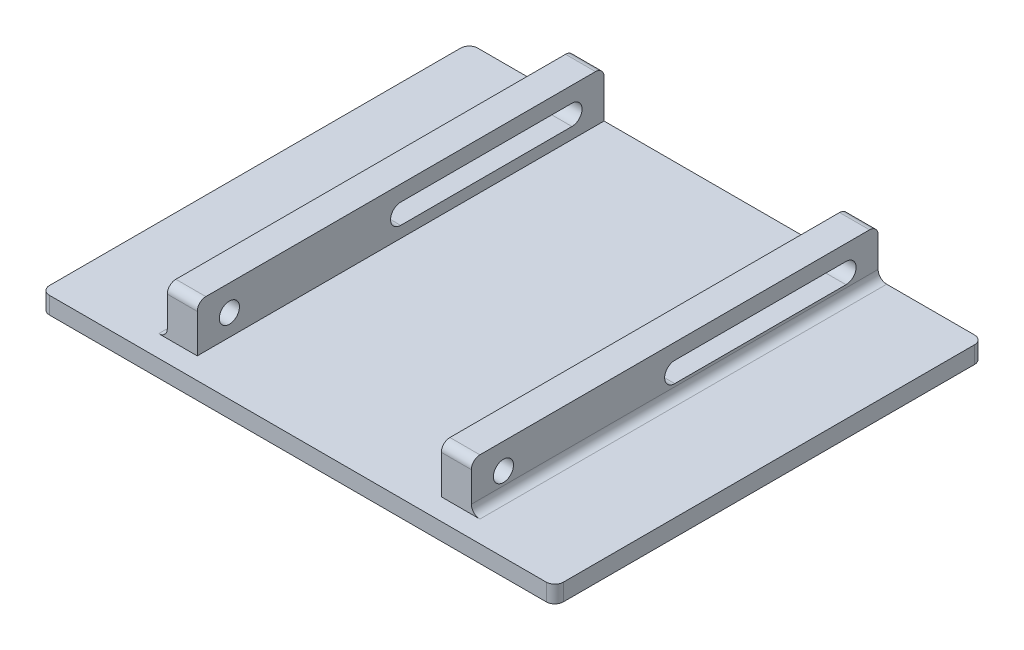
ISO-10303-21;
HEADER;
FILE_DESCRIPTION(('STEP AP214'),'2;1');
FILE_NAME('part.step','',(''),(''),'','','');
FILE_SCHEMA(('AUTOMOTIVE_DESIGN { 1 0 10303 214 1 1 1 1 }'));
ENDSEC;
DATA;
#1=APPLICATION_CONTEXT('core data for automotive mechanical design processes');
#2=APPLICATION_PROTOCOL_DEFINITION('international standard','automotive_design',2000,#1);
#3=PRODUCT_CONTEXT('',#1,'mechanical');
#4=PRODUCT('Part','Part','',(#3));
#5=PRODUCT_RELATED_PRODUCT_CATEGORY('part','',(#4));
#6=PRODUCT_DEFINITION_FORMATION('','',#4);
#7=PRODUCT_DEFINITION_CONTEXT('part definition',#1,'design');
#8=PRODUCT_DEFINITION('design','',#6,#7);
#9=PRODUCT_DEFINITION_SHAPE('','',#8);
#10=(LENGTH_UNIT() NAMED_UNIT(*) SI_UNIT(.MILLI.,.METRE.));
#11=(NAMED_UNIT(*) PLANE_ANGLE_UNIT() SI_UNIT($,.RADIAN.));
#12=(NAMED_UNIT(*) SI_UNIT($,.STERADIAN.) SOLID_ANGLE_UNIT());
#13=UNCERTAINTY_MEASURE_WITH_UNIT(LENGTH_MEASURE(1.E-05),#10,'distance_accuracy_value','');
#14=(GEOMETRIC_REPRESENTATION_CONTEXT(3) GLOBAL_UNCERTAINTY_ASSIGNED_CONTEXT((#13)) GLOBAL_UNIT_ASSIGNED_CONTEXT((#10,
#11,#12)) REPRESENTATION_CONTEXT('',''));
#15=CARTESIAN_POINT('',(0.,0.,0.));
#16=DIRECTION('',(0.,0.,1.));
#17=DIRECTION('',(1.,0.,0.));
#18=AXIS2_PLACEMENT_3D('',#15,#16,#17);
#19=CARTESIAN_POINT('',(60.,4.,-67.5));
#20=DIRECTION('',(-1.,0.,0.));
#21=DIRECTION('',(0.,0.,1.));
#22=AXIS2_PLACEMENT_3D('',#19,#20,#21);
#23=PLANE('',#22);
#24=DIRECTION('',(0.,0.,-1.));
#25=VECTOR('',#24,1.);
#26=CARTESIAN_POINT('',(60.,0.,-67.5));
#27=LINE('',#26,#25);
#28=CARTESIAN_POINT('',(60.,0.,30.5));
#29=VERTEX_POINT('',#28);
#30=CARTESIAN_POINT('',(60.,0.,-65.5));
#31=VERTEX_POINT('',#30);
#32=EDGE_CURVE('E374',#29,#31,#27,.T.);
#33=ORIENTED_EDGE('',*,*,#32,.T.);
#34=DIRECTION('',(0.,-1.,0.));
#35=VECTOR('',#34,1.);
#36=CARTESIAN_POINT('',(60.,4.,-65.5));
#37=LINE('',#36,#35);
#38=CARTESIAN_POINT('',(60.,4.,-65.5));
#39=VERTEX_POINT('',#38);
#40=EDGE_CURVE('E528',#31,#39,#37,.F.);
#41=ORIENTED_EDGE('',*,*,#40,.T.);
#42=DIRECTION('',(0.,0.,-1.));
#43=VECTOR('',#42,1.);
#44=CARTESIAN_POINT('',(60.,4.,-67.5));
#45=LINE('',#44,#43);
#46=CARTESIAN_POINT('',(60.,4.,30.5));
#47=VERTEX_POINT('',#46);
#48=EDGE_CURVE('E402',#47,#39,#45,.T.);
#49=ORIENTED_EDGE('',*,*,#48,.F.);
#50=DIRECTION('',(0.,1.,0.));
#51=VECTOR('',#50,1.);
#52=CARTESIAN_POINT('',(60.,4.,30.5));
#53=LINE('',#52,#51);
#54=EDGE_CURVE('E525',#47,#29,#53,.F.);
#55=ORIENTED_EDGE('',*,*,#54,.T.);
#56=EDGE_LOOP('',(#33,#41,#49,#55));
#57=FACE_BOUND('',#56,.T.);
#58=ADVANCED_FACE('F43',(#57),#23,.F.);
#59=CARTESIAN_POINT('',(-60.,4.,-67.5));
#60=DIRECTION('',(0.,0.,1.));
#61=DIRECTION('',(1.,0.,0.));
#62=AXIS2_PLACEMENT_3D('',#59,#60,#61);
#63=PLANE('',#62);
#64=DIRECTION('',(0.,-1.,0.));
#65=VECTOR('',#64,1.);
#66=CARTESIAN_POINT('',(28.5,15.,-67.5000000000001));
#67=LINE('',#66,#65);
#68=CARTESIAN_POINT('',(28.5,13.,-67.5000000000001));
#69=VERTEX_POINT('',#68);
#70=CARTESIAN_POINT('',(28.5,4.,-67.5));
#71=VERTEX_POINT('',#70);
#72=EDGE_CURVE('E378',#69,#71,#67,.T.);
#73=ORIENTED_EDGE('',*,*,#72,.F.);
#74=DIRECTION('',(-1.,0.,0.));
#75=VECTOR('',#74,1.);
#76=CARTESIAN_POINT('',(-60.,13.,-67.5));
#77=LINE('',#76,#75);
#78=CARTESIAN_POINT('',(35.5,13.,-67.5000000000001));
#79=VERTEX_POINT('',#78);
#80=EDGE_CURVE('E453',#69,#79,#77,.F.);
#81=ORIENTED_EDGE('',*,*,#80,.T.);
#82=DIRECTION('',(0.,-1.,0.));
#83=VECTOR('',#82,1.);
#84=CARTESIAN_POINT('',(35.5,15.,-67.5000000000001));
#85=LINE('',#84,#83);
#86=CARTESIAN_POINT('',(35.5,6.,-67.5000000000001));
#87=VERTEX_POINT('',#86);
#88=EDGE_CURVE('E342',#79,#87,#85,.T.);
#89=ORIENTED_EDGE('',*,*,#88,.T.);
#90=CARTESIAN_POINT('',(37.5,6.,-67.5));
#91=DIRECTION('',(0.,0.,1.));
#92=DIRECTION('',(1.,0.,0.));
#93=AXIS2_PLACEMENT_3D('',#90,#91,#92);
#94=CIRCLE('',#93,2.);
#95=CARTESIAN_POINT('',(37.5,4.,-67.5));
#96=VERTEX_POINT('',#95);
#97=EDGE_CURVE('E544',#87,#96,#94,.T.);
#98=ORIENTED_EDGE('',*,*,#97,.T.);
#99=DIRECTION('',(-1.,0.,0.));
#100=VECTOR('',#99,1.);
#101=CARTESIAN_POINT('',(-60.,4.,-67.5));
#102=LINE('',#101,#100);
#103=CARTESIAN_POINT('',(58.,4.,-67.5));
#104=VERTEX_POINT('',#103);
#105=EDGE_CURVE('E408',#104,#96,#102,.T.);
#106=ORIENTED_EDGE('',*,*,#105,.F.);
#107=DIRECTION('',(0.,-1.,0.));
#108=VECTOR('',#107,1.);
#109=CARTESIAN_POINT('',(58.,4.,-67.5));
#110=LINE('',#109,#108);
#111=CARTESIAN_POINT('',(58.,0.,-67.5));
#112=VERTEX_POINT('',#111);
#113=EDGE_CURVE('E446',#104,#112,#110,.T.);
#114=ORIENTED_EDGE('',*,*,#113,.T.);
#115=DIRECTION('',(-1.,0.,0.));
#116=VECTOR('',#115,1.);
#117=CARTESIAN_POINT('',(-60.,0.,-67.5));
#118=LINE('',#117,#116);
#119=CARTESIAN_POINT('',(-58.,0.,-67.5));
#120=VERTEX_POINT('',#119);
#121=EDGE_CURVE('E421',#112,#120,#118,.T.);
#122=ORIENTED_EDGE('',*,*,#121,.T.);
#123=DIRECTION('',(0.,-1.,0.));
#124=VECTOR('',#123,1.);
#125=CARTESIAN_POINT('',(-58.,4.,-67.5));
#126=LINE('',#125,#124);
#127=CARTESIAN_POINT('',(-58.,4.,-67.5));
#128=VERTEX_POINT('',#127);
#129=EDGE_CURVE('E443',#120,#128,#126,.F.);
#130=ORIENTED_EDGE('',*,*,#129,.T.);
#131=CARTESIAN_POINT('',(-37.5,4.,-67.5));
#132=VERTEX_POINT('',#131);
#133=EDGE_CURVE('E406',#132,#128,#102,.T.);
#134=ORIENTED_EDGE('',*,*,#133,.F.);
#135=CARTESIAN_POINT('',(-37.5,6.,-67.5));
#136=DIRECTION('',(0.,0.,1.));
#137=DIRECTION('',(1.,0.,0.));
#138=AXIS2_PLACEMENT_3D('',#135,#136,#137);
#139=CIRCLE('',#138,2.);
#140=CARTESIAN_POINT('',(-35.5,6.,-67.5));
#141=VERTEX_POINT('',#140);
#142=EDGE_CURVE('E11',#132,#141,#139,.T.);
#143=ORIENTED_EDGE('',*,*,#142,.T.);
#144=DIRECTION('',(0.,-1.,0.));
#145=VECTOR('',#144,1.);
#146=CARTESIAN_POINT('',(-35.5,15.,-67.5));
#147=LINE('',#146,#145);
#148=CARTESIAN_POINT('',(-35.5,13.,-67.5));
#149=VERTEX_POINT('',#148);
#150=EDGE_CURVE('E367',#149,#141,#147,.T.);
#151=ORIENTED_EDGE('',*,*,#150,.F.);
#152=DIRECTION('',(-1.,0.,0.));
#153=VECTOR('',#152,1.);
#154=CARTESIAN_POINT('',(-28.5,13.,-67.5));
#155=LINE('',#154,#153);
#156=CARTESIAN_POINT('',(-28.5,13.,-67.5));
#157=VERTEX_POINT('',#156);
#158=EDGE_CURVE('E450',#149,#157,#155,.F.);
#159=ORIENTED_EDGE('',*,*,#158,.T.);
#160=DIRECTION('',(0.,-1.,0.));
#161=VECTOR('',#160,1.);
#162=CARTESIAN_POINT('',(-28.5,15.,-67.5));
#163=LINE('',#162,#161);
#164=CARTESIAN_POINT('',(-28.5,4.,-67.5));
#165=VERTEX_POINT('',#164);
#166=EDGE_CURVE('E371',#157,#165,#163,.T.);
#167=ORIENTED_EDGE('',*,*,#166,.T.);
#168=EDGE_CURVE('E413',#71,#165,#102,.T.);
#169=ORIENTED_EDGE('',*,*,#168,.F.);
#170=EDGE_LOOP('',(#73,#81,#89,#98,#106,#114,#122,#130,#134,#143,#151,#159,#167,#169));
#171=FACE_BOUND('',#170,.T.);
#172=ADVANCED_FACE('F568',(#171),#63,.F.);
#173=CARTESIAN_POINT('',(-60.,4.,-67.5));
#174=DIRECTION('',(1.,0.,0.));
#175=DIRECTION('',(0.,0.,-1.));
#176=AXIS2_PLACEMENT_3D('',#173,#174,#175);
#177=PLANE('',#176);
#178=DIRECTION('',(0.,0.,1.));
#179=VECTOR('',#178,1.);
#180=CARTESIAN_POINT('',(-60.,4.,-67.5));
#181=LINE('',#180,#179);
#182=CARTESIAN_POINT('',(-60.,4.,-65.5));
#183=VERTEX_POINT('',#182);
#184=CARTESIAN_POINT('',(-60.,4.,30.5));
#185=VERTEX_POINT('',#184);
#186=EDGE_CURVE('E412',#183,#185,#181,.T.);
#187=ORIENTED_EDGE('',*,*,#186,.F.);
#188=DIRECTION('',(0.,-1.,0.));
#189=VECTOR('',#188,1.);
#190=CARTESIAN_POINT('',(-60.,4.,-65.5));
#191=LINE('',#190,#189);
#192=CARTESIAN_POINT('',(-60.,0.,-65.5));
#193=VERTEX_POINT('',#192);
#194=EDGE_CURVE('E534',#183,#193,#191,.T.);
#195=ORIENTED_EDGE('',*,*,#194,.T.);
#196=DIRECTION('',(0.,0.,1.));
#197=VECTOR('',#196,1.);
#198=CARTESIAN_POINT('',(-60.,0.,-67.5));
#199=LINE('',#198,#197);
#200=CARTESIAN_POINT('',(-60.,0.,30.5));
#201=VERTEX_POINT('',#200);
#202=EDGE_CURVE('E407',#193,#201,#199,.T.);
#203=ORIENTED_EDGE('',*,*,#202,.T.);
#204=DIRECTION('',(0.,1.,0.));
#205=VECTOR('',#204,1.);
#206=CARTESIAN_POINT('',(-60.,4.,30.5));
#207=LINE('',#206,#205);
#208=EDGE_CURVE('E530',#201,#185,#207,.T.);
#209=ORIENTED_EDGE('',*,*,#208,.T.);
#210=EDGE_LOOP('',(#187,#195,#203,#209));
#211=FACE_BOUND('',#210,.T.);
#212=ADVANCED_FACE('F609',(#211),#177,.F.);
#213=CARTESIAN_POINT('',(0.,4.,0.));
#214=DIRECTION('',(0.,1.,0.));
#215=DIRECTION('',(0.,0.,1.));
#216=AXIS2_PLACEMENT_3D('',#213,#214,#215);
#217=PLANE('',#216);
#218=ORIENTED_EDGE('',*,*,#105,.T.);
#219=DIRECTION('',(0.,0.,-1.));
#220=VECTOR('',#219,1.);
#221=CARTESIAN_POINT('',(37.5,4.,0.));
#222=LINE('',#221,#220);
#223=CARTESIAN_POINT('',(37.5,4.,27.4999999999999));
#224=VERTEX_POINT('',#223);
#225=EDGE_CURVE('E511',#96,#224,#222,.F.);
#226=ORIENTED_EDGE('',*,*,#225,.T.);
#227=DIRECTION('',(1.,0.,0.));
#228=VECTOR('',#227,1.);
#229=CARTESIAN_POINT('',(35.5,4.,27.4999999999999));
#230=LINE('',#229,#228);
#231=CARTESIAN_POINT('',(28.5,4.,27.4999999999999));
#232=VERTEX_POINT('',#231);
#233=EDGE_CURVE('E389',#232,#224,#230,.T.);
#234=ORIENTED_EDGE('',*,*,#233,.F.);
#235=DIRECTION('',(0.,0.,1.));
#236=VECTOR('',#235,1.);
#237=CARTESIAN_POINT('',(28.5,4.,27.4999999999999));
#238=LINE('',#237,#236);
#239=EDGE_CURVE('E357',#71,#232,#238,.T.);
#240=ORIENTED_EDGE('',*,*,#239,.F.);
#241=ORIENTED_EDGE('',*,*,#168,.T.);
#242=DIRECTION('',(0.,0.,-1.));
#243=VECTOR('',#242,1.);
#244=CARTESIAN_POINT('',(-28.5,4.,27.5));
#245=LINE('',#244,#243);
#246=CARTESIAN_POINT('',(-28.5,4.,27.5));
#247=VERTEX_POINT('',#246);
#248=EDGE_CURVE('E353',#247,#165,#245,.T.);
#249=ORIENTED_EDGE('',*,*,#248,.F.);
#250=DIRECTION('',(1.,0.,0.));
#251=VECTOR('',#250,1.);
#252=CARTESIAN_POINT('',(-35.5,4.,27.5));
#253=LINE('',#252,#251);
#254=CARTESIAN_POINT('',(-37.5,4.,27.5));
#255=VERTEX_POINT('',#254);
#256=EDGE_CURVE('E348',#255,#247,#253,.T.);
#257=ORIENTED_EDGE('',*,*,#256,.F.);
#258=DIRECTION('',(0.,0.,1.));
#259=VECTOR('',#258,1.);
#260=CARTESIAN_POINT('',(-37.5,4.,0.));
#261=LINE('',#260,#259);
#262=EDGE_CURVE('E508',#255,#132,#261,.F.);
#263=ORIENTED_EDGE('',*,*,#262,.T.);
#264=ORIENTED_EDGE('',*,*,#133,.T.);
#265=CARTESIAN_POINT('',(-58.,4.,-65.5));
#266=DIRECTION('',(0.,1.,0.));
#267=DIRECTION('',(0.,0.,1.));
#268=AXIS2_PLACEMENT_3D('',#265,#266,#267);
#269=CIRCLE('',#268,2.);
#270=EDGE_CURVE('E502',#128,#183,#269,.T.);
#271=ORIENTED_EDGE('',*,*,#270,.T.);
#272=ORIENTED_EDGE('',*,*,#186,.T.);
#273=CARTESIAN_POINT('',(-58.,4.,30.5));
#274=DIRECTION('',(0.,1.,0.));
#275=DIRECTION('',(0.,0.,1.));
#276=AXIS2_PLACEMENT_3D('',#273,#274,#275);
#277=CIRCLE('',#276,2.);
#278=CARTESIAN_POINT('',(-58.,4.,32.5));
#279=VERTEX_POINT('',#278);
#280=EDGE_CURVE('E499',#185,#279,#277,.T.);
#281=ORIENTED_EDGE('',*,*,#280,.T.);
#282=DIRECTION('',(-1.,0.,0.));
#283=VECTOR('',#282,1.);
#284=CARTESIAN_POINT('',(60.,4.,32.5));
#285=LINE('',#284,#283);
#286=CARTESIAN_POINT('',(58.,4.,32.5));
#287=VERTEX_POINT('',#286);
#288=EDGE_CURVE('E255',#287,#279,#285,.T.);
#289=ORIENTED_EDGE('',*,*,#288,.F.);
#290=CARTESIAN_POINT('',(58.,4.,30.5));
#291=DIRECTION('',(0.,1.,0.));
#292=DIRECTION('',(0.,0.,1.));
#293=AXIS2_PLACEMENT_3D('',#290,#291,#292);
#294=CIRCLE('',#293,2.);
#295=EDGE_CURVE('E496',#287,#47,#294,.T.);
#296=ORIENTED_EDGE('',*,*,#295,.T.);
#297=ORIENTED_EDGE('',*,*,#48,.T.);
#298=CARTESIAN_POINT('',(58.,4.,-65.5));
#299=DIRECTION('',(0.,1.,0.));
#300=DIRECTION('',(0.,0.,1.));
#301=AXIS2_PLACEMENT_3D('',#298,#299,#300);
#302=CIRCLE('',#301,2.);
#303=EDGE_CURVE('E505',#39,#104,#302,.T.);
#304=ORIENTED_EDGE('',*,*,#303,.T.);
#305=EDGE_LOOP('',(#218,#226,#234,#240,#241,#249,#257,#263,#264,#271,#272,#281,#289,#296,#297,#304));
#306=FACE_BOUND('',#305,.T.);
#307=ADVANCED_FACE('F563',(#306),#217,.T.);
#308=CARTESIAN_POINT('',(0.,0.,0.));
#309=DIRECTION('',(0.,1.,0.));
#310=DIRECTION('',(0.,0.,1.));
#311=AXIS2_PLACEMENT_3D('',#308,#309,#310);
#312=PLANE('',#311);
#313=ORIENTED_EDGE('',*,*,#121,.F.);
#314=CARTESIAN_POINT('',(58.,0.,-65.5));
#315=DIRECTION('',(0.,1.,0.));
#316=DIRECTION('',(0.,0.,1.));
#317=AXIS2_PLACEMENT_3D('',#314,#315,#316);
#318=CIRCLE('',#317,2.);
#319=EDGE_CURVE('E522',#112,#31,#318,.F.);
#320=ORIENTED_EDGE('',*,*,#319,.T.);
#321=ORIENTED_EDGE('',*,*,#32,.F.);
#322=CARTESIAN_POINT('',(58.,0.,30.5));
#323=DIRECTION('',(0.,1.,0.));
#324=DIRECTION('',(0.,0.,1.));
#325=AXIS2_PLACEMENT_3D('',#322,#323,#324);
#326=CIRCLE('',#325,2.);
#327=CARTESIAN_POINT('',(58.,0.,32.5));
#328=VERTEX_POINT('',#327);
#329=EDGE_CURVE('E515',#29,#328,#326,.F.);
#330=ORIENTED_EDGE('',*,*,#329,.T.);
#331=DIRECTION('',(-1.,0.,0.));
#332=VECTOR('',#331,1.);
#333=CARTESIAN_POINT('',(0.,0.,32.5));
#334=LINE('',#333,#332);
#335=CARTESIAN_POINT('',(-58.,0.,32.5));
#336=VERTEX_POINT('',#335);
#337=EDGE_CURVE('E417',#328,#336,#334,.T.);
#338=ORIENTED_EDGE('',*,*,#337,.T.);
#339=CARTESIAN_POINT('',(-58.,0.,30.5));
#340=DIRECTION('',(0.,1.,0.));
#341=DIRECTION('',(0.,0.,1.));
#342=AXIS2_PLACEMENT_3D('',#339,#340,#341);
#343=CIRCLE('',#342,2.);
#344=EDGE_CURVE('E59',#336,#201,#343,.F.);
#345=ORIENTED_EDGE('',*,*,#344,.T.);
#346=ORIENTED_EDGE('',*,*,#202,.F.);
#347=CARTESIAN_POINT('',(-58.,0.,-65.5));
#348=DIRECTION('',(0.,1.,0.));
#349=DIRECTION('',(0.,0.,1.));
#350=AXIS2_PLACEMENT_3D('',#347,#348,#349);
#351=CIRCLE('',#350,2.);
#352=EDGE_CURVE('E67',#193,#120,#351,.F.);
#353=ORIENTED_EDGE('',*,*,#352,.T.);
#354=EDGE_LOOP('',(#313,#320,#321,#330,#338,#345,#346,#353));
#355=FACE_BOUND('',#354,.T.);
#356=ADVANCED_FACE('F649',(#355),#312,.F.);
#357=CARTESIAN_POINT('',(35.5,15.,-67.5000000000001));
#358=DIRECTION('',(-1.,0.,0.));
#359=DIRECTION('',(0.,0.,1.));
#360=AXIS2_PLACEMENT_3D('',#357,#358,#359);
#361=PLANE('',#360);
#362=CARTESIAN_POINT('',(35.5,9.,19.9999999999999));
#363=DIRECTION('',(-1.,0.,0.));
#364=DIRECTION('',(0.,0.,1.));
#365=AXIS2_PLACEMENT_3D('',#362,#363,#364);
#366=CIRCLE('',#365,2.35);
#367=CARTESIAN_POINT('',(35.5,9.,22.3499999999999));
#368=VERTEX_POINT('',#367);
#369=EDGE_CURVE('E338',#368,#368,#366,.T.);
#370=ORIENTED_EDGE('',*,*,#369,.T.);
#371=EDGE_LOOP('',(#370));
#372=FACE_BOUND('',#371,.T.);
#373=DIRECTION('',(0.,0.,-1.));
#374=VECTOR('',#373,1.);
#375=CARTESIAN_POINT('',(35.5,11.35,-67.5000000000001));
#376=LINE('',#375,#374);
#377=CARTESIAN_POINT('',(35.5,11.35,-20.0000000000001));
#378=VERTEX_POINT('',#377);
#379=CARTESIAN_POINT('',(35.5,11.35,-60.0000000000001));
#380=VERTEX_POINT('',#379);
#381=EDGE_CURVE('E316',#378,#380,#376,.T.);
#382=ORIENTED_EDGE('',*,*,#381,.T.);
#383=CARTESIAN_POINT('',(35.5,9.,-60.0000000000001));
#384=DIRECTION('',(-1.,0.,0.));
#385=DIRECTION('',(0.,0.,1.));
#386=AXIS2_PLACEMENT_3D('',#383,#384,#385);
#387=CIRCLE('',#386,2.35);
#388=CARTESIAN_POINT('',(35.5,6.65,-60.0000000000001));
#389=VERTEX_POINT('',#388);
#390=EDGE_CURVE('E326',#380,#389,#387,.T.);
#391=ORIENTED_EDGE('',*,*,#390,.T.);
#392=DIRECTION('',(0.,0.,1.));
#393=VECTOR('',#392,1.);
#394=CARTESIAN_POINT('',(35.5,6.65,-67.5000000000001));
#395=LINE('',#394,#393);
#396=CARTESIAN_POINT('',(35.5,6.65,-20.));
#397=VERTEX_POINT('',#396);
#398=EDGE_CURVE('E294',#389,#397,#395,.T.);
#399=ORIENTED_EDGE('',*,*,#398,.T.);
#400=CARTESIAN_POINT('',(35.5,9.,-20.0000000000001));
#401=DIRECTION('',(-1.,0.,0.));
#402=DIRECTION('',(0.,0.,1.));
#403=AXIS2_PLACEMENT_3D('',#400,#401,#402);
#404=CIRCLE('',#403,2.35);
#405=EDGE_CURVE('E305',#397,#378,#404,.T.);
#406=ORIENTED_EDGE('',*,*,#405,.T.);
#407=EDGE_LOOP('',(#382,#391,#399,#406));
#408=FACE_BOUND('',#407,.T.);
#409=ORIENTED_EDGE('',*,*,#88,.F.);
#410=CARTESIAN_POINT('',(35.5,13.,-65.5));
#411=DIRECTION('',(-1.,0.,0.));
#412=DIRECTION('',(0.,0.,1.));
#413=AXIS2_PLACEMENT_3D('',#410,#411,#412);
#414=CIRCLE('',#413,2.);
#415=CARTESIAN_POINT('',(35.5,15.,-65.5));
#416=VERTEX_POINT('',#415);
#417=EDGE_CURVE('E463',#79,#416,#414,.F.);
#418=ORIENTED_EDGE('',*,*,#417,.T.);
#419=DIRECTION('',(0.,0.,-1.));
#420=VECTOR('',#419,1.);
#421=CARTESIAN_POINT('',(35.5,15.,-67.5000000000001));
#422=LINE('',#421,#420);
#423=CARTESIAN_POINT('',(35.5,15.,25.4999999999999));
#424=VERTEX_POINT('',#423);
#425=EDGE_CURVE('E392',#424,#416,#422,.T.);
#426=ORIENTED_EDGE('',*,*,#425,.F.);
#427=CARTESIAN_POINT('',(35.5,13.,25.4999999999999));
#428=DIRECTION('',(-1.,0.,0.));
#429=DIRECTION('',(0.,0.,1.));
#430=AXIS2_PLACEMENT_3D('',#427,#428,#429);
#431=CIRCLE('',#430,2.);
#432=CARTESIAN_POINT('',(35.5,13.,27.4999999999999));
#433=VERTEX_POINT('',#432);
#434=EDGE_CURVE('E460',#424,#433,#431,.F.);
#435=ORIENTED_EDGE('',*,*,#434,.T.);
#436=DIRECTION('',(0.,-1.,0.));
#437=VECTOR('',#436,1.);
#438=CARTESIAN_POINT('',(35.5,15.,27.4999999999999));
#439=LINE('',#438,#437);
#440=CARTESIAN_POINT('',(35.5,6.,27.4999999999999));
#441=VERTEX_POINT('',#440);
#442=EDGE_CURVE('E384',#433,#441,#439,.T.);
#443=ORIENTED_EDGE('',*,*,#442,.T.);
#444=DIRECTION('',(0.,0.,-1.));
#445=VECTOR('',#444,1.);
#446=CARTESIAN_POINT('',(35.5,6.,-67.5000000000001));
#447=LINE('',#446,#445);
#448=EDGE_CURVE('E456',#441,#87,#447,.T.);
#449=ORIENTED_EDGE('',*,*,#448,.T.);
#450=EDGE_LOOP('',(#409,#418,#426,#435,#443,#449));
#451=FACE_BOUND('',#450,.T.);
#452=ADVANCED_FACE('F636',(#372,#408,#451),#361,.F.);
#453=CARTESIAN_POINT('',(28.5,15.,27.4999999999999));
#454=DIRECTION('',(1.,0.,0.));
#455=DIRECTION('',(0.,0.,-1.));
#456=AXIS2_PLACEMENT_3D('',#453,#454,#455);
#457=PLANE('',#456);
#458=CARTESIAN_POINT('',(28.5,9.,19.9999999999999));
#459=DIRECTION('',(1.,0.,0.));
#460=DIRECTION('',(0.,0.,-1.));
#461=AXIS2_PLACEMENT_3D('',#458,#459,#460);
#462=CIRCLE('',#461,2.35);
#463=CARTESIAN_POINT('',(28.5,9.,17.6499999999999));
#464=VERTEX_POINT('',#463);
#465=EDGE_CURVE('E334',#464,#464,#462,.T.);
#466=ORIENTED_EDGE('',*,*,#465,.T.);
#467=EDGE_LOOP('',(#466));
#468=FACE_BOUND('',#467,.T.);
#469=DIRECTION('',(0.,0.,-1.));
#470=VECTOR('',#469,1.);
#471=CARTESIAN_POINT('',(28.5,6.64999999999999,27.4999999999999));
#472=LINE('',#471,#470);
#473=CARTESIAN_POINT('',(28.5,6.65,-20.0000000000001));
#474=VERTEX_POINT('',#473);
#475=CARTESIAN_POINT('',(28.5,6.65,-60.0000000000001));
#476=VERTEX_POINT('',#475);
#477=EDGE_CURVE('E290',#474,#476,#472,.T.);
#478=ORIENTED_EDGE('',*,*,#477,.T.);
#479=CARTESIAN_POINT('',(28.5,9.,-60.0000000000001));
#480=DIRECTION('',(1.,0.,0.));
#481=DIRECTION('',(0.,0.,-1.));
#482=AXIS2_PLACEMENT_3D('',#479,#480,#481);
#483=CIRCLE('',#482,2.35);
#484=CARTESIAN_POINT('',(28.5,11.35,-60.0000000000001));
#485=VERTEX_POINT('',#484);
#486=EDGE_CURVE('E322',#476,#485,#483,.T.);
#487=ORIENTED_EDGE('',*,*,#486,.T.);
#488=DIRECTION('',(0.,0.,1.));
#489=VECTOR('',#488,1.);
#490=CARTESIAN_POINT('',(28.5,11.35,27.4999999999999));
#491=LINE('',#490,#489);
#492=CARTESIAN_POINT('',(28.5,11.35,-20.0000000000001));
#493=VERTEX_POINT('',#492);
#494=EDGE_CURVE('E312',#485,#493,#491,.T.);
#495=ORIENTED_EDGE('',*,*,#494,.T.);
#496=CARTESIAN_POINT('',(28.5,9.,-20.0000000000001));
#497=DIRECTION('',(1.,0.,0.));
#498=DIRECTION('',(0.,0.,-1.));
#499=AXIS2_PLACEMENT_3D('',#496,#497,#498);
#500=CIRCLE('',#499,2.35);
#501=EDGE_CURVE('E301',#493,#474,#500,.T.);
#502=ORIENTED_EDGE('',*,*,#501,.T.);
#503=EDGE_LOOP('',(#478,#487,#495,#502));
#504=FACE_BOUND('',#503,.T.);
#505=DIRECTION('',(0.,0.,1.));
#506=VECTOR('',#505,1.);
#507=CARTESIAN_POINT('',(28.5,15.,27.4999999999999));
#508=LINE('',#507,#506);
#509=CARTESIAN_POINT('',(28.5,15.,-65.5));
#510=VERTEX_POINT('',#509);
#511=CARTESIAN_POINT('',(28.5,15.,25.5));
#512=VERTEX_POINT('',#511);
#513=EDGE_CURVE('E388',#510,#512,#508,.T.);
#514=ORIENTED_EDGE('',*,*,#513,.F.);
#515=CARTESIAN_POINT('',(28.5,13.,-65.5));
#516=DIRECTION('',(1.,0.,0.));
#517=DIRECTION('',(0.,0.,-1.));
#518=AXIS2_PLACEMENT_3D('',#515,#516,#517);
#519=CIRCLE('',#518,2.);
#520=EDGE_CURVE('E440',#510,#69,#519,.F.);
#521=ORIENTED_EDGE('',*,*,#520,.T.);
#522=ORIENTED_EDGE('',*,*,#72,.T.);
#523=ORIENTED_EDGE('',*,*,#239,.T.);
#524=DIRECTION('',(0.,-1.,0.));
#525=VECTOR('',#524,1.);
#526=CARTESIAN_POINT('',(28.5,15.,27.4999999999999));
#527=LINE('',#526,#525);
#528=CARTESIAN_POINT('',(28.5,13.,27.4999999999999));
#529=VERTEX_POINT('',#528);
#530=EDGE_CURVE('E381',#529,#232,#527,.T.);
#531=ORIENTED_EDGE('',*,*,#530,.F.);
#532=CARTESIAN_POINT('',(28.5,13.,25.5));
#533=DIRECTION('',(1.,0.,0.));
#534=DIRECTION('',(0.,0.,-1.));
#535=AXIS2_PLACEMENT_3D('',#532,#533,#534);
#536=CIRCLE('',#535,2.);
#537=EDGE_CURVE('E437',#529,#512,#536,.F.);
#538=ORIENTED_EDGE('',*,*,#537,.T.);
#539=EDGE_LOOP('',(#514,#521,#522,#523,#531,#538));
#540=FACE_BOUND('',#539,.T.);
#541=ADVANCED_FACE('F627',(#468,#504,#540),#457,.F.);
#542=CARTESIAN_POINT('',(35.5,15.,27.4999999999999));
#543=DIRECTION('',(0.,0.,-1.));
#544=DIRECTION('',(-1.,0.,0.));
#545=AXIS2_PLACEMENT_3D('',#542,#543,#544);
#546=PLANE('',#545);
#547=ORIENTED_EDGE('',*,*,#442,.F.);
#548=DIRECTION('',(1.,0.,0.));
#549=VECTOR('',#548,1.);
#550=CARTESIAN_POINT('',(35.5,13.,27.4999999999999));
#551=LINE('',#550,#549);
#552=EDGE_CURVE('E466',#433,#529,#551,.F.);
#553=ORIENTED_EDGE('',*,*,#552,.T.);
#554=ORIENTED_EDGE('',*,*,#530,.T.);
#555=ORIENTED_EDGE('',*,*,#233,.T.);
#556=CARTESIAN_POINT('',(37.5,6.,27.4999999999999));
#557=DIRECTION('',(0.,0.,-1.));
#558=DIRECTION('',(-1.,0.,0.));
#559=AXIS2_PLACEMENT_3D('',#556,#557,#558);
#560=CIRCLE('',#559,2.);
#561=EDGE_CURVE('E547',#224,#441,#560,.T.);
#562=ORIENTED_EDGE('',*,*,#561,.T.);
#563=EDGE_LOOP('',(#547,#553,#554,#555,#562));
#564=FACE_BOUND('',#563,.T.);
#565=ADVANCED_FACE('F688',(#564),#546,.F.);
#566=CARTESIAN_POINT('',(0.,15.,0.));
#567=DIRECTION('',(0.,-1.,0.));
#568=DIRECTION('',(0.,0.,-1.));
#569=AXIS2_PLACEMENT_3D('',#566,#567,#568);
#570=PLANE('',#569);
#571=ORIENTED_EDGE('',*,*,#425,.T.);
#572=DIRECTION('',(-1.,0.,0.));
#573=VECTOR('',#572,1.);
#574=CARTESIAN_POINT('',(0.,15.,-65.5));
#575=LINE('',#574,#573);
#576=EDGE_CURVE('E433',#416,#510,#575,.T.);
#577=ORIENTED_EDGE('',*,*,#576,.T.);
#578=ORIENTED_EDGE('',*,*,#513,.T.);
#579=DIRECTION('',(1.,0.,0.));
#580=VECTOR('',#579,1.);
#581=CARTESIAN_POINT('',(0.,15.,25.5));
#582=LINE('',#581,#580);
#583=EDGE_CURVE('E429',#512,#424,#582,.T.);
#584=ORIENTED_EDGE('',*,*,#583,.T.);
#585=EDGE_LOOP('',(#571,#577,#578,#584));
#586=FACE_BOUND('',#585,.T.);
#587=ADVANCED_FACE('F629',(#586),#570,.F.);
#588=CARTESIAN_POINT('',(-28.5,15.,27.5));
#589=DIRECTION('',(-1.,0.,0.));
#590=DIRECTION('',(0.,0.,1.));
#591=AXIS2_PLACEMENT_3D('',#588,#589,#590);
#592=PLANE('',#591);
#593=CARTESIAN_POINT('',(-28.5,9.,20.));
#594=DIRECTION('',(-1.,0.,0.));
#595=DIRECTION('',(0.,0.,1.));
#596=AXIS2_PLACEMENT_3D('',#593,#594,#595);
#597=CIRCLE('',#596,2.35);
#598=CARTESIAN_POINT('',(-28.5,9.,22.35));
#599=VERTEX_POINT('',#598);
#600=EDGE_CURVE('E330',#599,#599,#597,.T.);
#601=ORIENTED_EDGE('',*,*,#600,.T.);
#602=EDGE_LOOP('',(#601));
#603=FACE_BOUND('',#602,.T.);
#604=DIRECTION('',(0.,0.,-1.));
#605=VECTOR('',#604,1.);
#606=CARTESIAN_POINT('',(-28.5,11.35,27.5));
#607=LINE('',#606,#605);
#608=CARTESIAN_POINT('',(-28.5,11.35,-20.));
#609=VERTEX_POINT('',#608);
#610=CARTESIAN_POINT('',(-28.5,11.35,-60.));
#611=VERTEX_POINT('',#610);
#612=EDGE_CURVE('E309',#609,#611,#607,.T.);
#613=ORIENTED_EDGE('',*,*,#612,.T.);
#614=CARTESIAN_POINT('',(-28.5,9.,-60.));
#615=DIRECTION('',(-1.,0.,0.));
#616=DIRECTION('',(0.,0.,1.));
#617=AXIS2_PLACEMENT_3D('',#614,#615,#616);
#618=CIRCLE('',#617,2.35);
#619=CARTESIAN_POINT('',(-28.5,6.65,-60.));
#620=VERTEX_POINT('',#619);
#621=EDGE_CURVE('E250',#611,#620,#618,.T.);
#622=ORIENTED_EDGE('',*,*,#621,.T.);
#623=DIRECTION('',(0.,0.,1.));
#624=VECTOR('',#623,1.);
#625=CARTESIAN_POINT('',(-28.5,6.64999999999999,27.5));
#626=LINE('',#625,#624);
#627=CARTESIAN_POINT('',(-28.5,6.65,-20.));
#628=VERTEX_POINT('',#627);
#629=EDGE_CURVE('E281',#620,#628,#626,.T.);
#630=ORIENTED_EDGE('',*,*,#629,.T.);
#631=CARTESIAN_POINT('',(-28.5,9.,-20.));
#632=DIRECTION('',(-1.,0.,0.));
#633=DIRECTION('',(0.,0.,1.));
#634=AXIS2_PLACEMENT_3D('',#631,#632,#633);
#635=CIRCLE('',#634,2.35);
#636=EDGE_CURVE('E298',#628,#609,#635,.T.);
#637=ORIENTED_EDGE('',*,*,#636,.T.);
#638=EDGE_LOOP('',(#613,#622,#630,#637));
#639=FACE_BOUND('',#638,.T.);
#640=DIRECTION('',(0.,0.,-1.));
#641=VECTOR('',#640,1.);
#642=CARTESIAN_POINT('',(-28.5,15.,27.5));
#643=LINE('',#642,#641);
#644=CARTESIAN_POINT('',(-28.5,15.,25.5));
#645=VERTEX_POINT('',#644);
#646=CARTESIAN_POINT('',(-28.5,15.,-65.5));
#647=VERTEX_POINT('',#646);
#648=EDGE_CURVE('E343',#645,#647,#643,.T.);
#649=ORIENTED_EDGE('',*,*,#648,.F.);
#650=CARTESIAN_POINT('',(-28.5,13.,25.5));
#651=DIRECTION('',(-1.,0.,0.));
#652=DIRECTION('',(0.,0.,1.));
#653=AXIS2_PLACEMENT_3D('',#650,#651,#652);
#654=CIRCLE('',#653,2.);
#655=CARTESIAN_POINT('',(-28.5,13.,27.5));
#656=VERTEX_POINT('',#655);
#657=EDGE_CURVE('E480',#645,#656,#654,.F.);
#658=ORIENTED_EDGE('',*,*,#657,.T.);
#659=DIRECTION('',(0.,-1.,0.));
#660=VECTOR('',#659,1.);
#661=CARTESIAN_POINT('',(-28.5,15.,27.5));
#662=LINE('',#661,#660);
#663=EDGE_CURVE('E352',#656,#247,#662,.T.);
#664=ORIENTED_EDGE('',*,*,#663,.T.);
#665=ORIENTED_EDGE('',*,*,#248,.T.);
#666=ORIENTED_EDGE('',*,*,#166,.F.);
#667=CARTESIAN_POINT('',(-28.5,13.,-65.5));
#668=DIRECTION('',(-1.,0.,0.));
#669=DIRECTION('',(0.,0.,1.));
#670=AXIS2_PLACEMENT_3D('',#667,#668,#669);
#671=CIRCLE('',#670,2.);
#672=EDGE_CURVE('E477',#157,#647,#671,.F.);
#673=ORIENTED_EDGE('',*,*,#672,.T.);
#674=EDGE_LOOP('',(#649,#658,#664,#665,#666,#673));
#675=FACE_BOUND('',#674,.T.);
#676=ADVANCED_FACE('F580',(#603,#639,#675),#592,.F.);
#677=CARTESIAN_POINT('',(-35.5,15.,-67.5));
#678=DIRECTION('',(1.,0.,0.));
#679=DIRECTION('',(0.,0.,-1.));
#680=AXIS2_PLACEMENT_3D('',#677,#678,#679);
#681=PLANE('',#680);
#682=CARTESIAN_POINT('',(-35.5,9.,20.));
#683=DIRECTION('',(-1.,0.,0.));
#684=DIRECTION('',(0.,0.,1.));
#685=AXIS2_PLACEMENT_3D('',#682,#683,#684);
#686=CIRCLE('',#685,2.35);
#687=CARTESIAN_POINT('',(-35.5,9.,22.35));
#688=VERTEX_POINT('',#687);
#689=EDGE_CURVE('E275',#688,#688,#686,.T.);
#690=ORIENTED_EDGE('',*,*,#689,.F.);
#691=EDGE_LOOP('',(#690));
#692=FACE_BOUND('',#691,.T.);
#693=DIRECTION('',(0.,0.,1.));
#694=VECTOR('',#693,1.);
#695=CARTESIAN_POINT('',(-35.5,6.65,-20.));
#696=LINE('',#695,#694);
#697=CARTESIAN_POINT('',(-35.5,6.65,-60.0000000000001));
#698=VERTEX_POINT('',#697);
#699=CARTESIAN_POINT('',(-35.5,6.65,-20.));
#700=VERTEX_POINT('',#699);
#701=EDGE_CURVE('E273',#698,#700,#696,.T.);
#702=ORIENTED_EDGE('',*,*,#701,.F.);
#703=CARTESIAN_POINT('',(-35.5,9.,-60.));
#704=DIRECTION('',(-1.,0.,0.));
#705=DIRECTION('',(0.,0.,1.));
#706=AXIS2_PLACEMENT_3D('',#703,#704,#705);
#707=CIRCLE('',#706,2.35);
#708=CARTESIAN_POINT('',(-35.5,11.35,-60.));
#709=VERTEX_POINT('',#708);
#710=EDGE_CURVE('E247',#709,#698,#707,.T.);
#711=ORIENTED_EDGE('',*,*,#710,.F.);
#712=DIRECTION('',(0.,0.,-1.));
#713=VECTOR('',#712,1.);
#714=CARTESIAN_POINT('',(-35.5,11.35,-60.));
#715=LINE('',#714,#713);
#716=CARTESIAN_POINT('',(-35.5,11.35,-20.));
#717=VERTEX_POINT('',#716);
#718=EDGE_CURVE('E258',#717,#709,#715,.T.);
#719=ORIENTED_EDGE('',*,*,#718,.F.);
#720=CARTESIAN_POINT('',(-35.5,9.,-20.));
#721=DIRECTION('',(-1.,0.,0.));
#722=DIRECTION('',(0.,0.,1.));
#723=AXIS2_PLACEMENT_3D('',#720,#721,#722);
#724=CIRCLE('',#723,2.35);
#725=EDGE_CURVE('E266',#700,#717,#724,.T.);
#726=ORIENTED_EDGE('',*,*,#725,.F.);
#727=EDGE_LOOP('',(#702,#711,#719,#726));
#728=FACE_BOUND('',#727,.T.);
#729=DIRECTION('',(0.,-1.,0.));
#730=VECTOR('',#729,1.);
#731=CARTESIAN_POINT('',(-35.5,15.,27.5));
#732=LINE('',#731,#730);
#733=CARTESIAN_POINT('',(-35.5,13.,27.5));
#734=VERTEX_POINT('',#733);
#735=CARTESIAN_POINT('',(-35.5,6.,27.5));
#736=VERTEX_POINT('',#735);
#737=EDGE_CURVE('E363',#734,#736,#732,.T.);
#738=ORIENTED_EDGE('',*,*,#737,.F.);
#739=CARTESIAN_POINT('',(-35.5,13.,25.5));
#740=DIRECTION('',(1.,0.,0.));
#741=DIRECTION('',(0.,0.,-1.));
#742=AXIS2_PLACEMENT_3D('',#739,#740,#741);
#743=CIRCLE('',#742,2.);
#744=CARTESIAN_POINT('',(-35.5,15.,25.5));
#745=VERTEX_POINT('',#744);
#746=EDGE_CURVE('E493',#734,#745,#743,.F.);
#747=ORIENTED_EDGE('',*,*,#746,.T.);
#748=DIRECTION('',(0.,0.,1.));
#749=VECTOR('',#748,1.);
#750=CARTESIAN_POINT('',(-35.5,15.,-67.5));
#751=LINE('',#750,#749);
#752=CARTESIAN_POINT('',(-35.5,15.,-65.5));
#753=VERTEX_POINT('',#752);
#754=EDGE_CURVE('E347',#753,#745,#751,.T.);
#755=ORIENTED_EDGE('',*,*,#754,.F.);
#756=CARTESIAN_POINT('',(-35.5,13.,-65.5));
#757=DIRECTION('',(1.,0.,0.));
#758=DIRECTION('',(0.,0.,-1.));
#759=AXIS2_PLACEMENT_3D('',#756,#757,#758);
#760=CIRCLE('',#759,2.);
#761=EDGE_CURVE('E490',#753,#149,#760,.F.);
#762=ORIENTED_EDGE('',*,*,#761,.T.);
#763=ORIENTED_EDGE('',*,*,#150,.T.);
#764=DIRECTION('',(0.,0.,1.));
#765=VECTOR('',#764,1.);
#766=CARTESIAN_POINT('',(-35.5,6.,-67.5));
#767=LINE('',#766,#765);
#768=EDGE_CURVE('E486',#141,#736,#767,.T.);
#769=ORIENTED_EDGE('',*,*,#768,.T.);
#770=EDGE_LOOP('',(#738,#747,#755,#762,#763,#769));
#771=FACE_BOUND('',#770,.T.);
#772=ADVANCED_FACE('F270',(#692,#728,#771),#681,.F.);
#773=CARTESIAN_POINT('',(-35.5,15.,27.5));
#774=DIRECTION('',(0.,0.,-1.));
#775=DIRECTION('',(-1.,0.,0.));
#776=AXIS2_PLACEMENT_3D('',#773,#774,#775);
#777=PLANE('',#776);
#778=ORIENTED_EDGE('',*,*,#663,.F.);
#779=DIRECTION('',(1.,0.,0.));
#780=VECTOR('',#779,1.);
#781=CARTESIAN_POINT('',(-35.5,13.,27.5));
#782=LINE('',#781,#780);
#783=EDGE_CURVE('E483',#656,#734,#782,.F.);
#784=ORIENTED_EDGE('',*,*,#783,.T.);
#785=ORIENTED_EDGE('',*,*,#737,.T.);
#786=CARTESIAN_POINT('',(-37.5,6.,27.5));
#787=DIRECTION('',(0.,0.,-1.));
#788=DIRECTION('',(-1.,0.,0.));
#789=AXIS2_PLACEMENT_3D('',#786,#787,#788);
#790=CIRCLE('',#789,2.);
#791=EDGE_CURVE('E52',#736,#255,#790,.T.);
#792=ORIENTED_EDGE('',*,*,#791,.T.);
#793=ORIENTED_EDGE('',*,*,#256,.T.);
#794=EDGE_LOOP('',(#778,#784,#785,#792,#793));
#795=FACE_BOUND('',#794,.T.);
#796=ADVANCED_FACE('F554',(#795),#777,.F.);
#797=CARTESIAN_POINT('',(0.,15.,0.));
#798=DIRECTION('',(0.,1.,0.));
#799=DIRECTION('',(0.,0.,1.));
#800=AXIS2_PLACEMENT_3D('',#797,#798,#799);
#801=PLANE('',#800);
#802=ORIENTED_EDGE('',*,*,#754,.T.);
#803=DIRECTION('',(1.,0.,0.));
#804=VECTOR('',#803,1.);
#805=CARTESIAN_POINT('',(-28.5,15.,25.5));
#806=LINE('',#805,#804);
#807=EDGE_CURVE('E473',#745,#645,#806,.T.);
#808=ORIENTED_EDGE('',*,*,#807,.T.);
#809=ORIENTED_EDGE('',*,*,#648,.T.);
#810=DIRECTION('',(-1.,0.,0.));
#811=VECTOR('',#810,1.);
#812=CARTESIAN_POINT('',(-35.5,15.,-65.5));
#813=LINE('',#812,#811);
#814=EDGE_CURVE('E469',#647,#753,#813,.T.);
#815=ORIENTED_EDGE('',*,*,#814,.T.);
#816=EDGE_LOOP('',(#802,#808,#809,#815));
#817=FACE_BOUND('',#816,.T.);
#818=ADVANCED_FACE('F589',(#817),#801,.T.);
#819=CARTESIAN_POINT('',(60.,6.65,-20.0000000000001));
#820=DIRECTION('',(0.,-1.,0.));
#821=DIRECTION('',(0.,0.,-1.));
#822=AXIS2_PLACEMENT_3D('',#819,#820,#821);
#823=PLANE('',#822);
#824=DIRECTION('',(-1.,0.,0.));
#825=VECTOR('',#824,1.);
#826=CARTESIAN_POINT('',(60.,6.65,-60.0000000000001));
#827=LINE('',#826,#825);
#828=EDGE_CURVE('E665',#620,#698,#827,.T.);
#829=ORIENTED_EDGE('',*,*,#828,.T.);
#830=ORIENTED_EDGE('',*,*,#701,.T.);
#831=DIRECTION('',(-1.,0.,0.));
#832=VECTOR('',#831,1.);
#833=CARTESIAN_POINT('',(60.,6.65,-20.0000000000001));
#834=LINE('',#833,#832);
#835=EDGE_CURVE('E669',#628,#700,#834,.T.);
#836=ORIENTED_EDGE('',*,*,#835,.F.);
#837=ORIENTED_EDGE('',*,*,#629,.F.);
#838=EDGE_LOOP('',(#829,#830,#836,#837));
#839=FACE_BOUND('',#838,.T.);
#840=ADVANCED_FACE('F678',(#839),#823,.F.);
#841=CARTESIAN_POINT('',(60.,9.,-20.0000000000001));
#842=DIRECTION('',(-1.,0.,0.));
#843=DIRECTION('',(0.,0.,1.));
#844=AXIS2_PLACEMENT_3D('',#841,#842,#843);
#845=CYLINDRICAL_SURFACE('',#844,2.35);
#846=ORIENTED_EDGE('',*,*,#835,.T.);
#847=ORIENTED_EDGE('',*,*,#725,.T.);
#848=DIRECTION('',(-1.,0.,0.));
#849=VECTOR('',#848,1.);
#850=CARTESIAN_POINT('',(60.,11.35,-20.0000000000001));
#851=LINE('',#850,#849);
#852=EDGE_CURVE('E261',#609,#717,#851,.T.);
#853=ORIENTED_EDGE('',*,*,#852,.F.);
#854=ORIENTED_EDGE('',*,*,#636,.F.);
#855=EDGE_LOOP('',(#846,#847,#853,#854));
#856=FACE_BOUND('',#855,.T.);
#857=ADVANCED_FACE('F675',(#856),#845,.F.);
#858=CARTESIAN_POINT('',(60.,11.35,-60.0000000000001));
#859=DIRECTION('',(0.,1.,0.));
#860=DIRECTION('',(0.,0.,1.));
#861=AXIS2_PLACEMENT_3D('',#858,#859,#860);
#862=PLANE('',#861);
#863=ORIENTED_EDGE('',*,*,#852,.T.);
#864=ORIENTED_EDGE('',*,*,#718,.T.);
#865=DIRECTION('',(-1.,0.,0.));
#866=VECTOR('',#865,1.);
#867=CARTESIAN_POINT('',(60.,11.35,-60.0000000000001));
#868=LINE('',#867,#866);
#869=EDGE_CURVE('E242',#611,#709,#868,.T.);
#870=ORIENTED_EDGE('',*,*,#869,.F.);
#871=ORIENTED_EDGE('',*,*,#612,.F.);
#872=EDGE_LOOP('',(#863,#864,#870,#871));
#873=FACE_BOUND('',#872,.T.);
#874=ADVANCED_FACE('F259',(#873),#862,.F.);
#875=CARTESIAN_POINT('',(60.,9.,-60.0000000000001));
#876=DIRECTION('',(-1.,0.,0.));
#877=DIRECTION('',(0.,0.,1.));
#878=AXIS2_PLACEMENT_3D('',#875,#876,#877);
#879=CYLINDRICAL_SURFACE('',#878,2.35);
#880=ORIENTED_EDGE('',*,*,#869,.T.);
#881=ORIENTED_EDGE('',*,*,#710,.T.);
#882=ORIENTED_EDGE('',*,*,#828,.F.);
#883=ORIENTED_EDGE('',*,*,#621,.F.);
#884=EDGE_LOOP('',(#880,#881,#882,#883));
#885=FACE_BOUND('',#884,.T.);
#886=ADVANCED_FACE('F244',(#885),#879,.F.);
#887=CARTESIAN_POINT('',(60.,9.,19.9999999999999));
#888=DIRECTION('',(-1.,0.,0.));
#889=DIRECTION('',(0.,0.,1.));
#890=AXIS2_PLACEMENT_3D('',#887,#888,#889);
#891=CYLINDRICAL_SURFACE('',#890,2.35);
#892=ORIENTED_EDGE('',*,*,#689,.T.);
#893=EDGE_LOOP('',(#892));
#894=FACE_BOUND('',#893,.T.);
#895=ORIENTED_EDGE('',*,*,#600,.F.);
#896=EDGE_LOOP('',(#895));
#897=FACE_BOUND('',#896,.T.);
#898=ADVANCED_FACE('F854',(#894,#897),#891,.F.);
#899=EDGE_CURVE('E254',#380,#485,#868,.T.);
#900=ORIENTED_EDGE('',*,*,#899,.T.);
#901=ORIENTED_EDGE('',*,*,#486,.F.);
#902=EDGE_CURVE('E267',#389,#476,#827,.T.);
#903=ORIENTED_EDGE('',*,*,#902,.F.);
#904=ORIENTED_EDGE('',*,*,#390,.F.);
#905=EDGE_LOOP('',(#900,#901,#903,#904));
#906=FACE_BOUND('',#905,.T.);
#907=ADVANCED_FACE('F882',(#906),#879,.F.);
#908=EDGE_CURVE('E671',#378,#493,#851,.T.);
#909=ORIENTED_EDGE('',*,*,#908,.T.);
#910=ORIENTED_EDGE('',*,*,#494,.F.);
#911=ORIENTED_EDGE('',*,*,#899,.F.);
#912=ORIENTED_EDGE('',*,*,#381,.F.);
#913=EDGE_LOOP('',(#909,#910,#911,#912));
#914=FACE_BOUND('',#913,.T.);
#915=ADVANCED_FACE('F872',(#914),#862,.F.);
#916=EDGE_CURVE('E668',#397,#474,#834,.T.);
#917=ORIENTED_EDGE('',*,*,#916,.T.);
#918=ORIENTED_EDGE('',*,*,#501,.F.);
#919=ORIENTED_EDGE('',*,*,#908,.F.);
#920=ORIENTED_EDGE('',*,*,#405,.F.);
#921=EDGE_LOOP('',(#917,#918,#919,#920));
#922=FACE_BOUND('',#921,.T.);
#923=ADVANCED_FACE('F862',(#922),#845,.F.);
#924=ORIENTED_EDGE('',*,*,#902,.T.);
#925=ORIENTED_EDGE('',*,*,#477,.F.);
#926=ORIENTED_EDGE('',*,*,#916,.F.);
#927=ORIENTED_EDGE('',*,*,#398,.F.);
#928=EDGE_LOOP('',(#924,#925,#926,#927));
#929=FACE_BOUND('',#928,.T.);
#930=ADVANCED_FACE('F851',(#929),#823,.F.);
#931=ORIENTED_EDGE('',*,*,#465,.F.);
#932=EDGE_LOOP('',(#931));
#933=FACE_BOUND('',#932,.T.);
#934=ORIENTED_EDGE('',*,*,#369,.F.);
#935=EDGE_LOOP('',(#934));
#936=FACE_BOUND('',#935,.T.);
#937=ADVANCED_FACE('F763',(#933,#936),#891,.F.);
#938=CARTESIAN_POINT('',(60.,-6.,32.5));
#939=DIRECTION('',(0.,0.,-1.));
#940=DIRECTION('',(-1.,0.,0.));
#941=AXIS2_PLACEMENT_3D('',#938,#939,#940);
#942=PLANE('',#941);
#943=ORIENTED_EDGE('',*,*,#288,.T.);
#944=DIRECTION('',(0.,1.,0.));
#945=VECTOR('',#944,1.);
#946=CARTESIAN_POINT('',(-58.,-6.,32.5));
#947=LINE('',#946,#945);
#948=EDGE_CURVE('E541',#279,#336,#947,.F.);
#949=ORIENTED_EDGE('',*,*,#948,.T.);
#950=ORIENTED_EDGE('',*,*,#337,.F.);
#951=DIRECTION('',(0.,1.,0.));
#952=VECTOR('',#951,1.);
#953=CARTESIAN_POINT('',(58.,-6.,32.5));
#954=LINE('',#953,#952);
#955=EDGE_CURVE('E537',#328,#287,#954,.T.);
#956=ORIENTED_EDGE('',*,*,#955,.T.);
#957=EDGE_LOOP('',(#943,#949,#950,#956));
#958=FACE_BOUND('',#957,.T.);
#959=ADVANCED_FACE('F616',(#958),#942,.F.);
#960=CARTESIAN_POINT('',(0.,13.,-65.5));
#961=DIRECTION('',(-1.,0.,0.));
#962=DIRECTION('',(0.,0.,1.));
#963=AXIS2_PLACEMENT_3D('',#960,#961,#962);
#964=CYLINDRICAL_SURFACE('',#963,2.);
#965=ORIENTED_EDGE('',*,*,#417,.F.);
#966=ORIENTED_EDGE('',*,*,#80,.F.);
#967=ORIENTED_EDGE('',*,*,#520,.F.);
#968=ORIENTED_EDGE('',*,*,#576,.F.);
#969=EDGE_LOOP('',(#965,#966,#967,#968));
#970=FACE_BOUND('',#969,.T.);
#971=ADVANCED_FACE('F613',(#970),#964,.T.);
#972=CARTESIAN_POINT('',(0.,13.,25.5));
#973=DIRECTION('',(1.,0.,0.));
#974=DIRECTION('',(0.,0.,-1.));
#975=AXIS2_PLACEMENT_3D('',#972,#973,#974);
#976=CYLINDRICAL_SURFACE('',#975,2.);
#977=ORIENTED_EDGE('',*,*,#537,.F.);
#978=ORIENTED_EDGE('',*,*,#552,.F.);
#979=ORIENTED_EDGE('',*,*,#434,.F.);
#980=ORIENTED_EDGE('',*,*,#583,.F.);
#981=EDGE_LOOP('',(#977,#978,#979,#980));
#982=FACE_BOUND('',#981,.T.);
#983=ADVANCED_FACE('F602',(#982),#976,.T.);
#984=CARTESIAN_POINT('',(0.,13.,25.5));
#985=DIRECTION('',(-1.,0.,0.));
#986=DIRECTION('',(0.,0.,1.));
#987=AXIS2_PLACEMENT_3D('',#984,#985,#986);
#988=CYLINDRICAL_SURFACE('',#987,2.);
#989=ORIENTED_EDGE('',*,*,#746,.F.);
#990=ORIENTED_EDGE('',*,*,#783,.F.);
#991=ORIENTED_EDGE('',*,*,#657,.F.);
#992=ORIENTED_EDGE('',*,*,#807,.F.);
#993=EDGE_LOOP('',(#989,#990,#991,#992));
#994=FACE_BOUND('',#993,.T.);
#995=ADVANCED_FACE('F585',(#994),#988,.T.);
#996=CARTESIAN_POINT('',(0.,13.,-65.5));
#997=DIRECTION('',(1.,0.,0.));
#998=DIRECTION('',(0.,0.,-1.));
#999=AXIS2_PLACEMENT_3D('',#996,#997,#998);
#1000=CYLINDRICAL_SURFACE('',#999,2.);
#1001=ORIENTED_EDGE('',*,*,#672,.F.);
#1002=ORIENTED_EDGE('',*,*,#158,.F.);
#1003=ORIENTED_EDGE('',*,*,#761,.F.);
#1004=ORIENTED_EDGE('',*,*,#814,.F.);
#1005=EDGE_LOOP('',(#1001,#1002,#1003,#1004));
#1006=FACE_BOUND('',#1005,.T.);
#1007=ADVANCED_FACE('F592',(#1006),#1000,.T.);
#1008=CARTESIAN_POINT('',(37.5,6.,-67.5000000000001));
#1009=DIRECTION('',(0.,0.,-1.));
#1010=DIRECTION('',(-1.,0.,0.));
#1011=AXIS2_PLACEMENT_3D('',#1008,#1009,#1010);
#1012=CYLINDRICAL_SURFACE('',#1011,2.);
#1013=ORIENTED_EDGE('',*,*,#561,.F.);
#1014=ORIENTED_EDGE('',*,*,#225,.F.);
#1015=ORIENTED_EDGE('',*,*,#97,.F.);
#1016=ORIENTED_EDGE('',*,*,#448,.F.);
#1017=EDGE_LOOP('',(#1013,#1014,#1015,#1016));
#1018=FACE_BOUND('',#1017,.T.);
#1019=ADVANCED_FACE('F595',(#1018),#1012,.F.);
#1020=CARTESIAN_POINT('',(-37.5,6.,-67.5));
#1021=DIRECTION('',(0.,0.,1.));
#1022=DIRECTION('',(1.,0.,0.));
#1023=AXIS2_PLACEMENT_3D('',#1020,#1021,#1022);
#1024=CYLINDRICAL_SURFACE('',#1023,2.);
#1025=ORIENTED_EDGE('',*,*,#142,.F.);
#1026=ORIENTED_EDGE('',*,*,#262,.F.);
#1027=ORIENTED_EDGE('',*,*,#791,.F.);
#1028=ORIENTED_EDGE('',*,*,#768,.F.);
#1029=EDGE_LOOP('',(#1025,#1026,#1027,#1028));
#1030=FACE_BOUND('',#1029,.T.);
#1031=ADVANCED_FACE('F559',(#1030),#1024,.F.);
#1032=CARTESIAN_POINT('',(58.,4.,-65.5));
#1033=DIRECTION('',(0.,-1.,0.));
#1034=DIRECTION('',(0.,0.,-1.));
#1035=AXIS2_PLACEMENT_3D('',#1032,#1033,#1034);
#1036=CYLINDRICAL_SURFACE('',#1035,2.);
#1037=ORIENTED_EDGE('',*,*,#303,.F.);
#1038=ORIENTED_EDGE('',*,*,#40,.F.);
#1039=ORIENTED_EDGE('',*,*,#319,.F.);
#1040=ORIENTED_EDGE('',*,*,#113,.F.);
#1041=EDGE_LOOP('',(#1037,#1038,#1039,#1040));
#1042=FACE_BOUND('',#1041,.T.);
#1043=ADVANCED_FACE('F647',(#1042),#1036,.T.);
#1044=CARTESIAN_POINT('',(-58.,4.,-65.5));
#1045=DIRECTION('',(0.,-1.,0.));
#1046=DIRECTION('',(0.,0.,-1.));
#1047=AXIS2_PLACEMENT_3D('',#1044,#1045,#1046);
#1048=CYLINDRICAL_SURFACE('',#1047,2.);
#1049=ORIENTED_EDGE('',*,*,#270,.F.);
#1050=ORIENTED_EDGE('',*,*,#129,.F.);
#1051=ORIENTED_EDGE('',*,*,#352,.F.);
#1052=ORIENTED_EDGE('',*,*,#194,.F.);
#1053=EDGE_LOOP('',(#1049,#1050,#1051,#1052));
#1054=FACE_BOUND('',#1053,.T.);
#1055=ADVANCED_FACE('F810',(#1054),#1048,.T.);
#1056=CARTESIAN_POINT('',(-58.,4.,30.5));
#1057=DIRECTION('',(0.,1.,0.));
#1058=DIRECTION('',(0.,0.,1.));
#1059=AXIS2_PLACEMENT_3D('',#1056,#1057,#1058);
#1060=CYLINDRICAL_SURFACE('',#1059,2.);
#1061=ORIENTED_EDGE('',*,*,#344,.F.);
#1062=ORIENTED_EDGE('',*,*,#948,.F.);
#1063=ORIENTED_EDGE('',*,*,#280,.F.);
#1064=ORIENTED_EDGE('',*,*,#208,.F.);
#1065=EDGE_LOOP('',(#1061,#1062,#1063,#1064));
#1066=FACE_BOUND('',#1065,.T.);
#1067=ADVANCED_FACE('F655',(#1066),#1060,.T.);
#1068=CARTESIAN_POINT('',(58.,-6.,30.5));
#1069=DIRECTION('',(0.,1.,0.));
#1070=DIRECTION('',(0.,0.,1.));
#1071=AXIS2_PLACEMENT_3D('',#1068,#1069,#1070);
#1072=CYLINDRICAL_SURFACE('',#1071,2.);
#1073=ORIENTED_EDGE('',*,*,#329,.F.);
#1074=ORIENTED_EDGE('',*,*,#54,.F.);
#1075=ORIENTED_EDGE('',*,*,#295,.F.);
#1076=ORIENTED_EDGE('',*,*,#955,.F.);
#1077=EDGE_LOOP('',(#1073,#1074,#1075,#1076));
#1078=FACE_BOUND('',#1077,.T.);
#1079=ADVANCED_FACE('F45',(#1078),#1072,.T.);
#1080=CLOSED_SHELL('',(#58,#172,#212,#307,#356,#452,#541,#565,#587,#676,#772,#796,#818,#840,
#857,#874,#886,#898,#907,#915,#923,#930,#937,#959,#971,#983,#995,#1007,#1019,#1031,#1043,#1055,
#1067,#1079));
#1081=MANIFOLD_SOLID_BREP('B2',#1080);
#1082=ADVANCED_BREP_SHAPE_REPRESENTATION('',(#18,#1081),#14);
#1083=SHAPE_DEFINITION_REPRESENTATION(#9,#1082);
ENDSEC;
END-ISO-10303-21;
